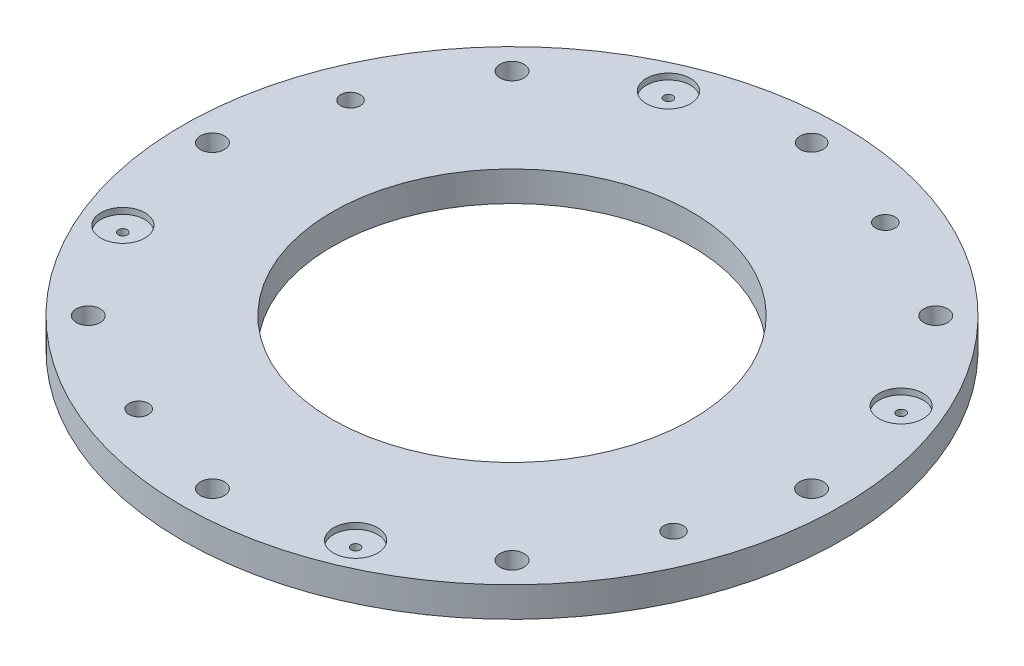
ISO-10303-21;
HEADER;
FILE_DESCRIPTION(('STEP AP214'),'2;1');
FILE_NAME('part.step','',(''),(''),'','','');
FILE_SCHEMA(('AUTOMOTIVE_DESIGN { 1 0 10303 214 1 1 1 1 }'));
ENDSEC;
DATA;
#1=APPLICATION_CONTEXT('core data for automotive mechanical design processes');
#2=APPLICATION_PROTOCOL_DEFINITION('international standard','automotive_design',2000,#1);
#3=PRODUCT_CONTEXT('',#1,'mechanical');
#4=PRODUCT('Part','Part','',(#3));
#5=PRODUCT_RELATED_PRODUCT_CATEGORY('part','',(#4));
#6=PRODUCT_DEFINITION_FORMATION('','',#4);
#7=PRODUCT_DEFINITION_CONTEXT('part definition',#1,'design');
#8=PRODUCT_DEFINITION('design','',#6,#7);
#9=PRODUCT_DEFINITION_SHAPE('','',#8);
#10=(LENGTH_UNIT() NAMED_UNIT(*) SI_UNIT(.MILLI.,.METRE.));
#11=(NAMED_UNIT(*) PLANE_ANGLE_UNIT() SI_UNIT($,.RADIAN.));
#12=(NAMED_UNIT(*) SI_UNIT($,.STERADIAN.) SOLID_ANGLE_UNIT());
#13=UNCERTAINTY_MEASURE_WITH_UNIT(LENGTH_MEASURE(1.E-05),#10,'distance_accuracy_value','');
#14=(GEOMETRIC_REPRESENTATION_CONTEXT(3) GLOBAL_UNCERTAINTY_ASSIGNED_CONTEXT((#13)) GLOBAL_UNIT_ASSIGNED_CONTEXT((#10,
#11,#12)) REPRESENTATION_CONTEXT('',''));
#15=CARTESIAN_POINT('',(0.,0.,0.));
#16=DIRECTION('',(0.,0.,1.));
#17=DIRECTION('',(1.,0.,0.));
#18=AXIS2_PLACEMENT_3D('',#15,#16,#17);
#19=CARTESIAN_POINT('',(0.,10.,0.));
#20=DIRECTION('',(0.,-1.,0.));
#21=DIRECTION('',(0.,0.,-1.));
#22=AXIS2_PLACEMENT_3D('',#19,#20,#21);
#23=CYLINDRICAL_SURFACE('',#22,110.);
#24=CARTESIAN_POINT('',(0.,10.,0.));
#25=DIRECTION('',(0.,1.,0.));
#26=DIRECTION('',(0.,0.,1.));
#27=AXIS2_PLACEMENT_3D('',#24,#25,#26);
#28=CIRCLE('',#27,110.);
#29=CARTESIAN_POINT('',(0.,10.,110.));
#30=VERTEX_POINT('',#29);
#31=EDGE_CURVE('E10',#30,#30,#28,.T.);
#32=ORIENTED_EDGE('',*,*,#31,.F.);
#33=EDGE_LOOP('',(#32));
#34=FACE_BOUND('',#33,.T.);
#35=CARTESIAN_POINT('',(0.,0.,0.));
#36=DIRECTION('',(0.,1.,0.));
#37=DIRECTION('',(0.,0.,1.));
#38=AXIS2_PLACEMENT_3D('',#35,#36,#37);
#39=CIRCLE('',#38,110.);
#40=CARTESIAN_POINT('',(0.,0.,110.));
#41=VERTEX_POINT('',#40);
#42=EDGE_CURVE('E42',#41,#41,#39,.T.);
#43=ORIENTED_EDGE('',*,*,#42,.T.);
#44=EDGE_LOOP('',(#43));
#45=FACE_BOUND('',#44,.T.);
#46=ADVANCED_FACE('F35',(#34,#45),#23,.T.);
#47=CARTESIAN_POINT('',(0.,10.,0.));
#48=DIRECTION('',(0.,1.,0.));
#49=DIRECTION('',(0.,0.,1.));
#50=AXIS2_PLACEMENT_3D('',#47,#48,#49);
#51=PLANE('',#50);
#52=CARTESIAN_POINT('',(91.046524442377,10.,-38.842229875376));
#53=DIRECTION('',(0.,1.,0.));
#54=DIRECTION('',(0.,0.,1.));
#55=AXIS2_PLACEMENT_3D('',#52,#53,#54);
#56=CIRCLE('',#55,7.35000000000001);
#57=CARTESIAN_POINT('',(91.046524442377,10.,-31.492229875376));
#58=VERTEX_POINT('',#57);
#59=EDGE_CURVE('E347',#58,#58,#56,.T.);
#60=ORIENTED_EDGE('',*,*,#59,.F.);
#61=EDGE_LOOP('',(#60));
#62=FACE_BOUND('',#61,.T.);
#63=CARTESIAN_POINT('',(38.842229875376,10.,91.046524442377));
#64=DIRECTION('',(0.,1.,0.));
#65=DIRECTION('',(0.,0.,1.));
#66=AXIS2_PLACEMENT_3D('',#63,#64,#65);
#67=CIRCLE('',#66,7.35000000000002);
#68=CARTESIAN_POINT('',(38.842229875376,10.,98.3965244423771));
#69=VERTEX_POINT('',#68);
#70=EDGE_CURVE('E350',#69,#69,#67,.T.);
#71=ORIENTED_EDGE('',*,*,#70,.F.);
#72=EDGE_LOOP('',(#71));
#73=FACE_BOUND('',#72,.T.);
#74=CARTESIAN_POINT('',(-91.046524442377,10.,38.842229875376));
#75=DIRECTION('',(0.,1.,0.));
#76=DIRECTION('',(0.,0.,1.));
#77=AXIS2_PLACEMENT_3D('',#74,#75,#76);
#78=CIRCLE('',#77,7.35000000000001);
#79=CARTESIAN_POINT('',(-91.046524442377,10.,46.192229875376));
#80=VERTEX_POINT('',#79);
#81=EDGE_CURVE('E356',#80,#80,#78,.T.);
#82=ORIENTED_EDGE('',*,*,#81,.F.);
#83=EDGE_LOOP('',(#82));
#84=FACE_BOUND('',#83,.T.);
#85=CARTESIAN_POINT('',(-38.842229875376,10.,-91.046524442377));
#86=DIRECTION('',(0.,1.,0.));
#87=DIRECTION('',(0.,0.,1.));
#88=AXIS2_PLACEMENT_3D('',#85,#86,#87);
#89=CIRCLE('',#88,7.34999999999999);
#90=CARTESIAN_POINT('',(-38.842229875376,10.,-83.696524442377));
#91=VERTEX_POINT('',#90);
#92=EDGE_CURVE('E68',#91,#91,#89,.T.);
#93=ORIENTED_EDGE('',*,*,#92,.F.);
#94=EDGE_LOOP('',(#93));
#95=FACE_BOUND('',#94,.T.);
#96=CARTESIAN_POINT('',(89.2547357831486,10.,35.3495705812719));
#97=DIRECTION('',(0.,1.,0.));
#98=DIRECTION('',(0.,0.,1.));
#99=AXIS2_PLACEMENT_3D('',#96,#97,#98);
#100=CIRCLE('',#99,3.25000000000002);
#101=CARTESIAN_POINT('',(89.2547357831486,10.,38.5995705812719));
#102=VERTEX_POINT('',#101);
#103=EDGE_CURVE('E81',#102,#102,#100,.T.);
#104=ORIENTED_EDGE('',*,*,#103,.F.);
#105=EDGE_LOOP('',(#104));
#106=FACE_BOUND('',#105,.T.);
#107=CARTESIAN_POINT('',(-35.3495705812719,10.,89.2547357831486));
#108=DIRECTION('',(0.,1.,0.));
#109=DIRECTION('',(0.,0.,1.));
#110=AXIS2_PLACEMENT_3D('',#107,#108,#109);
#111=CIRCLE('',#110,3.25000000000001);
#112=CARTESIAN_POINT('',(-35.3495705812719,10.,92.5047357831486));
#113=VERTEX_POINT('',#112);
#114=EDGE_CURVE('E84',#113,#113,#111,.T.);
#115=ORIENTED_EDGE('',*,*,#114,.F.);
#116=EDGE_LOOP('',(#115));
#117=FACE_BOUND('',#116,.T.);
#118=CARTESIAN_POINT('',(-89.2547357831486,10.,-35.3495705812719));
#119=DIRECTION('',(0.,1.,0.));
#120=DIRECTION('',(0.,0.,1.));
#121=AXIS2_PLACEMENT_3D('',#118,#119,#120);
#122=CIRCLE('',#121,3.25000000000002);
#123=CARTESIAN_POINT('',(-89.2547357831486,10.,-32.0995705812719));
#124=VERTEX_POINT('',#123);
#125=EDGE_CURVE('E90',#124,#124,#122,.T.);
#126=ORIENTED_EDGE('',*,*,#125,.F.);
#127=EDGE_LOOP('',(#126));
#128=FACE_BOUND('',#127,.T.);
#129=CARTESIAN_POINT('',(35.3495705812719,10.,-89.2547357831486));
#130=DIRECTION('',(0.,1.,0.));
#131=DIRECTION('',(0.,0.,1.));
#132=AXIS2_PLACEMENT_3D('',#129,#130,#131);
#133=CIRCLE('',#132,3.25000000000004);
#134=CARTESIAN_POINT('',(35.3495705812719,10.,-86.0047357831486));
#135=VERTEX_POINT('',#134);
#136=EDGE_CURVE('E96',#135,#135,#133,.T.);
#137=ORIENTED_EDGE('',*,*,#136,.F.);
#138=EDGE_LOOP('',(#137));
#139=FACE_BOUND('',#138,.T.);
#140=CARTESIAN_POINT('',(0.,10.,0.));
#141=DIRECTION('',(0.,1.,0.));
#142=DIRECTION('',(0.,0.,1.));
#143=AXIS2_PLACEMENT_3D('',#140,#141,#142);
#144=CIRCLE('',#143,60.);
#145=CARTESIAN_POINT('',(0.,10.,60.));
#146=VERTEX_POINT('',#145);
#147=EDGE_CURVE('E80',#146,#146,#144,.T.);
#148=ORIENTED_EDGE('',*,*,#147,.F.);
#149=EDGE_LOOP('',(#148));
#150=FACE_BOUND('',#149,.T.);
#151=CARTESIAN_POINT('',(-100.,10.,0.));
#152=DIRECTION('',(0.,1.,0.));
#153=DIRECTION('',(0.,0.,1.));
#154=AXIS2_PLACEMENT_3D('',#151,#152,#153);
#155=CIRCLE('',#154,4.00000000000001);
#156=CARTESIAN_POINT('',(-100.,10.,4.00000000000001));
#157=VERTEX_POINT('',#156);
#158=EDGE_CURVE('E111',#157,#157,#155,.T.);
#159=ORIENTED_EDGE('',*,*,#158,.F.);
#160=EDGE_LOOP('',(#159));
#161=FACE_BOUND('',#160,.T.);
#162=CARTESIAN_POINT('',(100.,10.,0.));
#163=DIRECTION('',(0.,1.,0.));
#164=DIRECTION('',(0.,0.,1.));
#165=AXIS2_PLACEMENT_3D('',#162,#163,#164);
#166=CIRCLE('',#165,4.00000000000001);
#167=CARTESIAN_POINT('',(100.,10.,4.00000000000001));
#168=VERTEX_POINT('',#167);
#169=EDGE_CURVE('E128',#168,#168,#166,.T.);
#170=ORIENTED_EDGE('',*,*,#169,.F.);
#171=EDGE_LOOP('',(#170));
#172=FACE_BOUND('',#171,.T.);
#173=CARTESIAN_POINT('',(70.7106781186548,10.,-70.7106781186548));
#174=DIRECTION('',(0.,1.,0.));
#175=DIRECTION('',(0.,0.,1.));
#176=AXIS2_PLACEMENT_3D('',#173,#174,#175);
#177=CIRCLE('',#176,4.00000000000002);
#178=CARTESIAN_POINT('',(70.7106781186548,10.,-66.7106781186548));
#179=VERTEX_POINT('',#178);
#180=EDGE_CURVE('E122',#179,#179,#177,.T.);
#181=ORIENTED_EDGE('',*,*,#180,.F.);
#182=EDGE_LOOP('',(#181));
#183=FACE_BOUND('',#182,.T.);
#184=CARTESIAN_POINT('',(0.,10.,-100.));
#185=DIRECTION('',(0.,1.,0.));
#186=DIRECTION('',(0.,0.,1.));
#187=AXIS2_PLACEMENT_3D('',#184,#185,#186);
#188=CIRCLE('',#187,3.86210274699493);
#189=CARTESIAN_POINT('',(0.,10.,-96.1378972530051));
#190=VERTEX_POINT('',#189);
#191=EDGE_CURVE('E115',#190,#190,#188,.T.);
#192=ORIENTED_EDGE('',*,*,#191,.F.);
#193=EDGE_LOOP('',(#192));
#194=FACE_BOUND('',#193,.T.);
#195=CARTESIAN_POINT('',(-70.7106781186548,10.,70.7106781186548));
#196=DIRECTION('',(0.,1.,0.));
#197=DIRECTION('',(0.,0.,1.));
#198=AXIS2_PLACEMENT_3D('',#195,#196,#197);
#199=CIRCLE('',#198,4.00000000000001);
#200=CARTESIAN_POINT('',(-70.7106781186548,10.,74.7106781186548));
#201=VERTEX_POINT('',#200);
#202=EDGE_CURVE('E114',#201,#201,#199,.T.);
#203=ORIENTED_EDGE('',*,*,#202,.F.);
#204=EDGE_LOOP('',(#203));
#205=FACE_BOUND('',#204,.T.);
#206=CARTESIAN_POINT('',(0.,10.,100.));
#207=DIRECTION('',(0.,1.,0.));
#208=DIRECTION('',(0.,0.,1.));
#209=AXIS2_PLACEMENT_3D('',#206,#207,#208);
#210=CIRCLE('',#209,4.);
#211=CARTESIAN_POINT('',(0.,10.,104.));
#212=VERTEX_POINT('',#211);
#213=EDGE_CURVE('E148',#212,#212,#210,.T.);
#214=ORIENTED_EDGE('',*,*,#213,.F.);
#215=EDGE_LOOP('',(#214));
#216=FACE_BOUND('',#215,.T.);
#217=CARTESIAN_POINT('',(70.7106781186548,10.,70.7106781186548));
#218=DIRECTION('',(0.,1.,0.));
#219=DIRECTION('',(0.,0.,1.));
#220=AXIS2_PLACEMENT_3D('',#217,#218,#219);
#221=CIRCLE('',#220,3.99999999999999);
#222=CARTESIAN_POINT('',(70.7106781186548,10.,74.7106781186547));
#223=VERTEX_POINT('',#222);
#224=EDGE_CURVE('E133',#223,#223,#221,.T.);
#225=ORIENTED_EDGE('',*,*,#224,.F.);
#226=EDGE_LOOP('',(#225));
#227=FACE_BOUND('',#226,.T.);
#228=CARTESIAN_POINT('',(-70.7106781186548,10.,-70.7106781186548));
#229=DIRECTION('',(0.,1.,0.));
#230=DIRECTION('',(0.,0.,1.));
#231=AXIS2_PLACEMENT_3D('',#228,#229,#230);
#232=CIRCLE('',#231,4.00000000000001);
#233=CARTESIAN_POINT('',(-70.7106781186548,10.,-66.7106781186548));
#234=VERTEX_POINT('',#233);
#235=EDGE_CURVE('E139',#234,#234,#232,.T.);
#236=ORIENTED_EDGE('',*,*,#235,.F.);
#237=EDGE_LOOP('',(#236));
#238=FACE_BOUND('',#237,.T.);
#239=ORIENTED_EDGE('',*,*,#31,.T.);
#240=EDGE_LOOP('',(#239));
#241=FACE_BOUND('',#240,.T.);
#242=ADVANCED_FACE('F175',(#62,#73,#84,#95,#106,#117,#128,#139,#150,#161,#172,#183,#194,#205,
#216,#227,#238,#241),#51,.T.);
#243=CARTESIAN_POINT('',(0.,0.,0.));
#244=DIRECTION('',(0.,1.,0.));
#245=DIRECTION('',(0.,0.,1.));
#246=AXIS2_PLACEMENT_3D('',#243,#244,#245);
#247=PLANE('',#246);
#248=CARTESIAN_POINT('',(-38.842229875376,0.,-91.046524442377));
#249=DIRECTION('',(0.,1.,0.));
#250=DIRECTION('',(0.,0.,1.));
#251=AXIS2_PLACEMENT_3D('',#248,#249,#250);
#252=CIRCLE('',#251,1.5);
#253=CARTESIAN_POINT('',(-38.842229875376,0.,-89.546524442377));
#254=VERTEX_POINT('',#253);
#255=EDGE_CURVE('E57',#254,#254,#252,.T.);
#256=ORIENTED_EDGE('',*,*,#255,.T.);
#257=EDGE_LOOP('',(#256));
#258=FACE_BOUND('',#257,.T.);
#259=CARTESIAN_POINT('',(91.046524442377,0.,-38.842229875376));
#260=DIRECTION('',(0.,1.,0.));
#261=DIRECTION('',(0.,0.,1.));
#262=AXIS2_PLACEMENT_3D('',#259,#260,#261);
#263=CIRCLE('',#262,1.5);
#264=CARTESIAN_POINT('',(91.046524442377,0.,-37.342229875376));
#265=VERTEX_POINT('',#264);
#266=EDGE_CURVE('E197',#265,#265,#263,.T.);
#267=ORIENTED_EDGE('',*,*,#266,.T.);
#268=EDGE_LOOP('',(#267));
#269=FACE_BOUND('',#268,.T.);
#270=CARTESIAN_POINT('',(38.842229875376,0.,91.046524442377));
#271=DIRECTION('',(0.,1.,0.));
#272=DIRECTION('',(0.,0.,1.));
#273=AXIS2_PLACEMENT_3D('',#270,#271,#272);
#274=CIRCLE('',#273,1.5);
#275=CARTESIAN_POINT('',(38.842229875376,0.,92.546524442377));
#276=VERTEX_POINT('',#275);
#277=EDGE_CURVE('E201',#276,#276,#274,.T.);
#278=ORIENTED_EDGE('',*,*,#277,.T.);
#279=EDGE_LOOP('',(#278));
#280=FACE_BOUND('',#279,.T.);
#281=CARTESIAN_POINT('',(-91.046524442377,0.,38.842229875376));
#282=DIRECTION('',(0.,1.,0.));
#283=DIRECTION('',(0.,0.,1.));
#284=AXIS2_PLACEMENT_3D('',#281,#282,#283);
#285=CIRCLE('',#284,1.5);
#286=CARTESIAN_POINT('',(-91.046524442377,0.,40.342229875376));
#287=VERTEX_POINT('',#286);
#288=EDGE_CURVE('E205',#287,#287,#285,.T.);
#289=ORIENTED_EDGE('',*,*,#288,.T.);
#290=EDGE_LOOP('',(#289));
#291=FACE_BOUND('',#290,.T.);
#292=CARTESIAN_POINT('',(89.2547357831486,0.,35.3495705812719));
#293=DIRECTION('',(0.,1.,0.));
#294=DIRECTION('',(0.,0.,1.));
#295=AXIS2_PLACEMENT_3D('',#292,#293,#294);
#296=CIRCLE('',#295,3.25000000000002);
#297=CARTESIAN_POINT('',(89.2547357831486,0.,38.5995705812719));
#298=VERTEX_POINT('',#297);
#299=EDGE_CURVE('E77',#298,#298,#296,.T.);
#300=ORIENTED_EDGE('',*,*,#299,.T.);
#301=EDGE_LOOP('',(#300));
#302=FACE_BOUND('',#301,.T.);
#303=CARTESIAN_POINT('',(-35.3495705812719,0.,89.2547357831486));
#304=DIRECTION('',(0.,1.,0.));
#305=DIRECTION('',(0.,0.,1.));
#306=AXIS2_PLACEMENT_3D('',#303,#304,#305);
#307=CIRCLE('',#306,3.25000000000001);
#308=CARTESIAN_POINT('',(-35.3495705812719,0.,92.5047357831486));
#309=VERTEX_POINT('',#308);
#310=EDGE_CURVE('E87',#309,#309,#307,.T.);
#311=ORIENTED_EDGE('',*,*,#310,.T.);
#312=EDGE_LOOP('',(#311));
#313=FACE_BOUND('',#312,.T.);
#314=CARTESIAN_POINT('',(-89.2547357831486,0.,-35.3495705812719));
#315=DIRECTION('',(0.,1.,0.));
#316=DIRECTION('',(0.,0.,1.));
#317=AXIS2_PLACEMENT_3D('',#314,#315,#316);
#318=CIRCLE('',#317,3.25000000000002);
#319=CARTESIAN_POINT('',(-89.2547357831486,0.,-32.0995705812719));
#320=VERTEX_POINT('',#319);
#321=EDGE_CURVE('E93',#320,#320,#318,.T.);
#322=ORIENTED_EDGE('',*,*,#321,.T.);
#323=EDGE_LOOP('',(#322));
#324=FACE_BOUND('',#323,.T.);
#325=CARTESIAN_POINT('',(35.3495705812719,0.,-89.2547357831486));
#326=DIRECTION('',(0.,1.,0.));
#327=DIRECTION('',(0.,0.,1.));
#328=AXIS2_PLACEMENT_3D('',#325,#326,#327);
#329=CIRCLE('',#328,3.25000000000004);
#330=CARTESIAN_POINT('',(35.3495705812719,0.,-86.0047357831486));
#331=VERTEX_POINT('',#330);
#332=EDGE_CURVE('E99',#331,#331,#329,.T.);
#333=ORIENTED_EDGE('',*,*,#332,.T.);
#334=EDGE_LOOP('',(#333));
#335=FACE_BOUND('',#334,.T.);
#336=CARTESIAN_POINT('',(0.,0.,0.));
#337=DIRECTION('',(0.,1.,0.));
#338=DIRECTION('',(0.,0.,1.));
#339=AXIS2_PLACEMENT_3D('',#336,#337,#338);
#340=CIRCLE('',#339,60.);
#341=CARTESIAN_POINT('',(0.,0.,60.));
#342=VERTEX_POINT('',#341);
#343=EDGE_CURVE('E103',#342,#342,#340,.T.);
#344=ORIENTED_EDGE('',*,*,#343,.T.);
#345=EDGE_LOOP('',(#344));
#346=FACE_BOUND('',#345,.T.);
#347=CARTESIAN_POINT('',(-100.,0.,0.));
#348=DIRECTION('',(0.,1.,0.));
#349=DIRECTION('',(0.,0.,1.));
#350=AXIS2_PLACEMENT_3D('',#347,#348,#349);
#351=CIRCLE('',#350,4.00000000000001);
#352=CARTESIAN_POINT('',(-100.,0.,4.00000000000001));
#353=VERTEX_POINT('',#352);
#354=EDGE_CURVE('E47',#353,#353,#351,.T.);
#355=ORIENTED_EDGE('',*,*,#354,.T.);
#356=EDGE_LOOP('',(#355));
#357=FACE_BOUND('',#356,.T.);
#358=CARTESIAN_POINT('',(100.,0.,0.));
#359=DIRECTION('',(0.,1.,0.));
#360=DIRECTION('',(0.,0.,1.));
#361=AXIS2_PLACEMENT_3D('',#358,#359,#360);
#362=CIRCLE('',#361,4.00000000000001);
#363=CARTESIAN_POINT('',(100.,0.,4.00000000000001));
#364=VERTEX_POINT('',#363);
#365=EDGE_CURVE('E106',#364,#364,#362,.T.);
#366=ORIENTED_EDGE('',*,*,#365,.T.);
#367=EDGE_LOOP('',(#366));
#368=FACE_BOUND('',#367,.T.);
#369=CARTESIAN_POINT('',(70.7106781186548,0.,-70.7106781186548));
#370=DIRECTION('',(0.,1.,0.));
#371=DIRECTION('',(0.,0.,1.));
#372=AXIS2_PLACEMENT_3D('',#369,#370,#371);
#373=CIRCLE('',#372,4.00000000000002);
#374=CARTESIAN_POINT('',(70.7106781186548,0.,-66.7106781186548));
#375=VERTEX_POINT('',#374);
#376=EDGE_CURVE('E125',#375,#375,#373,.T.);
#377=ORIENTED_EDGE('',*,*,#376,.T.);
#378=EDGE_LOOP('',(#377));
#379=FACE_BOUND('',#378,.T.);
#380=CARTESIAN_POINT('',(0.,0.,-100.));
#381=DIRECTION('',(0.,1.,0.));
#382=DIRECTION('',(0.,0.,1.));
#383=AXIS2_PLACEMENT_3D('',#380,#381,#382);
#384=CIRCLE('',#383,3.86210274699493);
#385=CARTESIAN_POINT('',(0.,0.,-96.1378972530051));
#386=VERTEX_POINT('',#385);
#387=EDGE_CURVE('E119',#386,#386,#384,.T.);
#388=ORIENTED_EDGE('',*,*,#387,.T.);
#389=EDGE_LOOP('',(#388));
#390=FACE_BOUND('',#389,.T.);
#391=CARTESIAN_POINT('',(-70.7106781186548,0.,70.7106781186548));
#392=DIRECTION('',(0.,1.,0.));
#393=DIRECTION('',(0.,0.,1.));
#394=AXIS2_PLACEMENT_3D('',#391,#392,#393);
#395=CIRCLE('',#394,4.00000000000001);
#396=CARTESIAN_POINT('',(-70.7106781186548,0.,74.7106781186548));
#397=VERTEX_POINT('',#396);
#398=EDGE_CURVE('E146',#397,#397,#395,.T.);
#399=ORIENTED_EDGE('',*,*,#398,.T.);
#400=EDGE_LOOP('',(#399));
#401=FACE_BOUND('',#400,.T.);
#402=CARTESIAN_POINT('',(0.,0.,100.));
#403=DIRECTION('',(0.,1.,0.));
#404=DIRECTION('',(0.,0.,1.));
#405=AXIS2_PLACEMENT_3D('',#402,#403,#404);
#406=CIRCLE('',#405,4.);
#407=CARTESIAN_POINT('',(0.,0.,104.));
#408=VERTEX_POINT('',#407);
#409=EDGE_CURVE('E50',#408,#408,#406,.T.);
#410=ORIENTED_EDGE('',*,*,#409,.T.);
#411=EDGE_LOOP('',(#410));
#412=FACE_BOUND('',#411,.T.);
#413=CARTESIAN_POINT('',(70.7106781186548,0.,70.7106781186548));
#414=DIRECTION('',(0.,1.,0.));
#415=DIRECTION('',(0.,0.,1.));
#416=AXIS2_PLACEMENT_3D('',#413,#414,#415);
#417=CIRCLE('',#416,3.99999999999999);
#418=CARTESIAN_POINT('',(70.7106781186548,0.,74.7106781186547));
#419=VERTEX_POINT('',#418);
#420=EDGE_CURVE('E136',#419,#419,#417,.T.);
#421=ORIENTED_EDGE('',*,*,#420,.T.);
#422=EDGE_LOOP('',(#421));
#423=FACE_BOUND('',#422,.T.);
#424=CARTESIAN_POINT('',(-70.7106781186548,0.,-70.7106781186548));
#425=DIRECTION('',(0.,1.,0.));
#426=DIRECTION('',(0.,0.,1.));
#427=AXIS2_PLACEMENT_3D('',#424,#425,#426);
#428=CIRCLE('',#427,4.00000000000001);
#429=CARTESIAN_POINT('',(-70.7106781186548,0.,-66.7106781186548));
#430=VERTEX_POINT('',#429);
#431=EDGE_CURVE('E118',#430,#430,#428,.T.);
#432=ORIENTED_EDGE('',*,*,#431,.T.);
#433=EDGE_LOOP('',(#432));
#434=FACE_BOUND('',#433,.T.);
#435=ORIENTED_EDGE('',*,*,#42,.F.);
#436=EDGE_LOOP('',(#435));
#437=FACE_BOUND('',#436,.T.);
#438=ADVANCED_FACE('F155',(#258,#269,#280,#291,#302,#313,#324,#335,#346,#357,#368,#379,#390,
#401,#412,#423,#434,#437),#247,.F.);
#439=CARTESIAN_POINT('',(-70.7106781186548,0.,-70.7106781186548));
#440=DIRECTION('',(0.,1.,0.));
#441=DIRECTION('',(0.,0.,1.));
#442=AXIS2_PLACEMENT_3D('',#439,#440,#441);
#443=CYLINDRICAL_SURFACE('',#442,4.00000000000001);
#444=ORIENTED_EDGE('',*,*,#431,.F.);
#445=EDGE_LOOP('',(#444));
#446=FACE_BOUND('',#445,.T.);
#447=ORIENTED_EDGE('',*,*,#235,.T.);
#448=EDGE_LOOP('',(#447));
#449=FACE_BOUND('',#448,.T.);
#450=ADVANCED_FACE('F170',(#446,#449),#443,.F.);
#451=CARTESIAN_POINT('',(70.7106781186548,0.,70.7106781186548));
#452=DIRECTION('',(0.,1.,0.));
#453=DIRECTION('',(0.,0.,1.));
#454=AXIS2_PLACEMENT_3D('',#451,#452,#453);
#455=CYLINDRICAL_SURFACE('',#454,3.99999999999999);
#456=ORIENTED_EDGE('',*,*,#420,.F.);
#457=EDGE_LOOP('',(#456));
#458=FACE_BOUND('',#457,.T.);
#459=ORIENTED_EDGE('',*,*,#224,.T.);
#460=EDGE_LOOP('',(#459));
#461=FACE_BOUND('',#460,.T.);
#462=ADVANCED_FACE('F161',(#458,#461),#455,.F.);
#463=CARTESIAN_POINT('',(0.,0.,100.));
#464=DIRECTION('',(0.,1.,0.));
#465=DIRECTION('',(0.,0.,1.));
#466=AXIS2_PLACEMENT_3D('',#463,#464,#465);
#467=CYLINDRICAL_SURFACE('',#466,4.);
#468=ORIENTED_EDGE('',*,*,#409,.F.);
#469=EDGE_LOOP('',(#468));
#470=FACE_BOUND('',#469,.T.);
#471=ORIENTED_EDGE('',*,*,#213,.T.);
#472=EDGE_LOOP('',(#471));
#473=FACE_BOUND('',#472,.T.);
#474=ADVANCED_FACE('F158',(#470,#473),#467,.F.);
#475=CARTESIAN_POINT('',(-70.7106781186548,0.,70.7106781186548));
#476=DIRECTION('',(0.,1.,0.));
#477=DIRECTION('',(0.,0.,1.));
#478=AXIS2_PLACEMENT_3D('',#475,#476,#477);
#479=CYLINDRICAL_SURFACE('',#478,4.00000000000001);
#480=ORIENTED_EDGE('',*,*,#398,.F.);
#481=EDGE_LOOP('',(#480));
#482=FACE_BOUND('',#481,.T.);
#483=ORIENTED_EDGE('',*,*,#202,.T.);
#484=EDGE_LOOP('',(#483));
#485=FACE_BOUND('',#484,.T.);
#486=ADVANCED_FACE('F160',(#482,#485),#479,.F.);
#487=CARTESIAN_POINT('',(0.,0.,-100.));
#488=DIRECTION('',(0.,1.,0.));
#489=DIRECTION('',(0.,0.,1.));
#490=AXIS2_PLACEMENT_3D('',#487,#488,#489);
#491=CYLINDRICAL_SURFACE('',#490,3.86210274699493);
#492=ORIENTED_EDGE('',*,*,#387,.F.);
#493=EDGE_LOOP('',(#492));
#494=FACE_BOUND('',#493,.T.);
#495=ORIENTED_EDGE('',*,*,#191,.T.);
#496=EDGE_LOOP('',(#495));
#497=FACE_BOUND('',#496,.T.);
#498=ADVANCED_FACE('F167',(#494,#497),#491,.F.);
#499=CARTESIAN_POINT('',(70.7106781186548,0.,-70.7106781186548));
#500=DIRECTION('',(0.,1.,0.));
#501=DIRECTION('',(0.,0.,1.));
#502=AXIS2_PLACEMENT_3D('',#499,#500,#501);
#503=CYLINDRICAL_SURFACE('',#502,4.00000000000002);
#504=ORIENTED_EDGE('',*,*,#376,.F.);
#505=EDGE_LOOP('',(#504));
#506=FACE_BOUND('',#505,.T.);
#507=ORIENTED_EDGE('',*,*,#180,.T.);
#508=EDGE_LOOP('',(#507));
#509=FACE_BOUND('',#508,.T.);
#510=ADVANCED_FACE('F238',(#506,#509),#503,.F.);
#511=CARTESIAN_POINT('',(100.,0.,0.));
#512=DIRECTION('',(0.,1.,0.));
#513=DIRECTION('',(0.,0.,1.));
#514=AXIS2_PLACEMENT_3D('',#511,#512,#513);
#515=CYLINDRICAL_SURFACE('',#514,4.00000000000001);
#516=ORIENTED_EDGE('',*,*,#365,.F.);
#517=EDGE_LOOP('',(#516));
#518=FACE_BOUND('',#517,.T.);
#519=ORIENTED_EDGE('',*,*,#169,.T.);
#520=EDGE_LOOP('',(#519));
#521=FACE_BOUND('',#520,.T.);
#522=ADVANCED_FACE('F245',(#518,#521),#515,.F.);
#523=CARTESIAN_POINT('',(-100.,0.,0.));
#524=DIRECTION('',(0.,1.,0.));
#525=DIRECTION('',(0.,0.,1.));
#526=AXIS2_PLACEMENT_3D('',#523,#524,#525);
#527=CYLINDRICAL_SURFACE('',#526,4.00000000000001);
#528=ORIENTED_EDGE('',*,*,#354,.F.);
#529=EDGE_LOOP('',(#528));
#530=FACE_BOUND('',#529,.T.);
#531=ORIENTED_EDGE('',*,*,#158,.T.);
#532=EDGE_LOOP('',(#531));
#533=FACE_BOUND('',#532,.T.);
#534=ADVANCED_FACE('F249',(#530,#533),#527,.F.);
#535=CARTESIAN_POINT('',(0.,0.,0.));
#536=DIRECTION('',(0.,1.,0.));
#537=DIRECTION('',(0.,0.,1.));
#538=AXIS2_PLACEMENT_3D('',#535,#536,#537);
#539=CYLINDRICAL_SURFACE('',#538,60.);
#540=ORIENTED_EDGE('',*,*,#343,.F.);
#541=EDGE_LOOP('',(#540));
#542=FACE_BOUND('',#541,.T.);
#543=ORIENTED_EDGE('',*,*,#147,.T.);
#544=EDGE_LOOP('',(#543));
#545=FACE_BOUND('',#544,.T.);
#546=ADVANCED_FACE('F257',(#542,#545),#539,.F.);
#547=CARTESIAN_POINT('',(35.3495705812719,0.,-89.2547357831486));
#548=DIRECTION('',(0.,1.,0.));
#549=DIRECTION('',(0.,0.,1.));
#550=AXIS2_PLACEMENT_3D('',#547,#548,#549);
#551=CYLINDRICAL_SURFACE('',#550,3.25000000000004);
#552=ORIENTED_EDGE('',*,*,#332,.F.);
#553=EDGE_LOOP('',(#552));
#554=FACE_BOUND('',#553,.T.);
#555=ORIENTED_EDGE('',*,*,#136,.T.);
#556=EDGE_LOOP('',(#555));
#557=FACE_BOUND('',#556,.T.);
#558=ADVANCED_FACE('F268',(#554,#557),#551,.F.);
#559=CARTESIAN_POINT('',(-89.2547357831486,0.,-35.3495705812719));
#560=DIRECTION('',(0.,1.,0.));
#561=DIRECTION('',(0.,0.,1.));
#562=AXIS2_PLACEMENT_3D('',#559,#560,#561);
#563=CYLINDRICAL_SURFACE('',#562,3.25000000000002);
#564=ORIENTED_EDGE('',*,*,#321,.F.);
#565=EDGE_LOOP('',(#564));
#566=FACE_BOUND('',#565,.T.);
#567=ORIENTED_EDGE('',*,*,#125,.T.);
#568=EDGE_LOOP('',(#567));
#569=FACE_BOUND('',#568,.T.);
#570=ADVANCED_FACE('F276',(#566,#569),#563,.F.);
#571=CARTESIAN_POINT('',(-35.3495705812719,0.,89.2547357831486));
#572=DIRECTION('',(0.,1.,0.));
#573=DIRECTION('',(0.,0.,1.));
#574=AXIS2_PLACEMENT_3D('',#571,#572,#573);
#575=CYLINDRICAL_SURFACE('',#574,3.25000000000001);
#576=ORIENTED_EDGE('',*,*,#310,.F.);
#577=EDGE_LOOP('',(#576));
#578=FACE_BOUND('',#577,.T.);
#579=ORIENTED_EDGE('',*,*,#114,.T.);
#580=EDGE_LOOP('',(#579));
#581=FACE_BOUND('',#580,.T.);
#582=ADVANCED_FACE('F283',(#578,#581),#575,.F.);
#583=CARTESIAN_POINT('',(89.2547357831486,0.,35.3495705812719));
#584=DIRECTION('',(0.,1.,0.));
#585=DIRECTION('',(0.,0.,1.));
#586=AXIS2_PLACEMENT_3D('',#583,#584,#585);
#587=CYLINDRICAL_SURFACE('',#586,3.25000000000002);
#588=ORIENTED_EDGE('',*,*,#299,.F.);
#589=EDGE_LOOP('',(#588));
#590=FACE_BOUND('',#589,.T.);
#591=ORIENTED_EDGE('',*,*,#103,.T.);
#592=EDGE_LOOP('',(#591));
#593=FACE_BOUND('',#592,.T.);
#594=ADVANCED_FACE('F287',(#590,#593),#587,.F.);
#595=CARTESIAN_POINT('',(-38.842229875376,8.,-91.046524442377));
#596=DIRECTION('',(0.,1.,0.));
#597=DIRECTION('',(0.,0.,1.));
#598=AXIS2_PLACEMENT_3D('',#595,#596,#597);
#599=CYLINDRICAL_SURFACE('',#598,7.34999999999999);
#600=CARTESIAN_POINT('',(-38.842229875376,8.,-91.046524442377));
#601=DIRECTION('',(0.,1.,0.));
#602=DIRECTION('',(0.,0.,1.));
#603=AXIS2_PLACEMENT_3D('',#600,#601,#602);
#604=CIRCLE('',#603,7.34999999999999);
#605=CARTESIAN_POINT('',(-38.842229875376,8.,-83.696524442377));
#606=VERTEX_POINT('',#605);
#607=EDGE_CURVE('E64',#606,#606,#604,.T.);
#608=ORIENTED_EDGE('',*,*,#607,.F.);
#609=EDGE_LOOP('',(#608));
#610=FACE_BOUND('',#609,.T.);
#611=ORIENTED_EDGE('',*,*,#92,.T.);
#612=EDGE_LOOP('',(#611));
#613=FACE_BOUND('',#612,.T.);
#614=ADVANCED_FACE('F291',(#610,#613),#599,.F.);
#615=CARTESIAN_POINT('',(-38.842229875376,8.,-91.046524442377));
#616=DIRECTION('',(0.,1.,0.));
#617=DIRECTION('',(0.,0.,1.));
#618=AXIS2_PLACEMENT_3D('',#615,#616,#617);
#619=PLANE('',#618);
#620=CARTESIAN_POINT('',(-38.842229875376,8.,-91.046524442377));
#621=DIRECTION('',(0.,1.,0.));
#622=DIRECTION('',(0.,0.,1.));
#623=AXIS2_PLACEMENT_3D('',#620,#621,#622);
#624=CIRCLE('',#623,1.5);
#625=CARTESIAN_POINT('',(-38.842229875376,8.,-89.546524442377));
#626=VERTEX_POINT('',#625);
#627=EDGE_CURVE('E38',#626,#626,#624,.T.);
#628=ORIENTED_EDGE('',*,*,#627,.F.);
#629=EDGE_LOOP('',(#628));
#630=FACE_BOUND('',#629,.T.);
#631=ORIENTED_EDGE('',*,*,#607,.T.);
#632=EDGE_LOOP('',(#631));
#633=FACE_BOUND('',#632,.T.);
#634=ADVANCED_FACE('F293',(#630,#633),#619,.T.);
#635=CARTESIAN_POINT('',(-91.046524442377,8.,38.842229875376));
#636=DIRECTION('',(0.,1.,0.));
#637=DIRECTION('',(0.,0.,1.));
#638=AXIS2_PLACEMENT_3D('',#635,#636,#637);
#639=CYLINDRICAL_SURFACE('',#638,7.35000000000001);
#640=CARTESIAN_POINT('',(-91.046524442377,8.,38.842229875376));
#641=DIRECTION('',(0.,1.,0.));
#642=DIRECTION('',(0.,0.,1.));
#643=AXIS2_PLACEMENT_3D('',#640,#641,#642);
#644=CIRCLE('',#643,7.35000000000001);
#645=CARTESIAN_POINT('',(-91.046524442377,8.,46.192229875376));
#646=VERTEX_POINT('',#645);
#647=EDGE_CURVE('E73',#646,#646,#644,.T.);
#648=ORIENTED_EDGE('',*,*,#647,.F.);
#649=EDGE_LOOP('',(#648));
#650=FACE_BOUND('',#649,.T.);
#651=ORIENTED_EDGE('',*,*,#81,.T.);
#652=EDGE_LOOP('',(#651));
#653=FACE_BOUND('',#652,.T.);
#654=ADVANCED_FACE('F296',(#650,#653),#639,.F.);
#655=CARTESIAN_POINT('',(-91.046524442377,8.,38.842229875376));
#656=DIRECTION('',(0.,1.,0.));
#657=DIRECTION('',(0.,0.,1.));
#658=AXIS2_PLACEMENT_3D('',#655,#656,#657);
#659=PLANE('',#658);
#660=CARTESIAN_POINT('',(-91.046524442377,8.,38.842229875376));
#661=DIRECTION('',(0.,1.,0.));
#662=DIRECTION('',(0.,0.,1.));
#663=AXIS2_PLACEMENT_3D('',#660,#661,#662);
#664=CIRCLE('',#663,1.5);
#665=CARTESIAN_POINT('',(-91.046524442377,8.,40.342229875376));
#666=VERTEX_POINT('',#665);
#667=EDGE_CURVE('E59',#666,#666,#664,.T.);
#668=ORIENTED_EDGE('',*,*,#667,.F.);
#669=EDGE_LOOP('',(#668));
#670=FACE_BOUND('',#669,.T.);
#671=ORIENTED_EDGE('',*,*,#647,.T.);
#672=EDGE_LOOP('',(#671));
#673=FACE_BOUND('',#672,.T.);
#674=ADVANCED_FACE('F301',(#670,#673),#659,.T.);
#675=CARTESIAN_POINT('',(38.842229875376,8.,91.046524442377));
#676=DIRECTION('',(0.,1.,0.));
#677=DIRECTION('',(0.,0.,1.));
#678=AXIS2_PLACEMENT_3D('',#675,#676,#677);
#679=CYLINDRICAL_SURFACE('',#678,7.35000000000002);
#680=CARTESIAN_POINT('',(38.842229875376,8.,91.046524442377));
#681=DIRECTION('',(0.,1.,0.));
#682=DIRECTION('',(0.,0.,1.));
#683=AXIS2_PLACEMENT_3D('',#680,#681,#682);
#684=CIRCLE('',#683,7.35000000000002);
#685=CARTESIAN_POINT('',(38.842229875376,8.,98.3965244423771));
#686=VERTEX_POINT('',#685);
#687=EDGE_CURVE('E353',#686,#686,#684,.T.);
#688=ORIENTED_EDGE('',*,*,#687,.F.);
#689=EDGE_LOOP('',(#688));
#690=FACE_BOUND('',#689,.T.);
#691=ORIENTED_EDGE('',*,*,#70,.T.);
#692=EDGE_LOOP('',(#691));
#693=FACE_BOUND('',#692,.T.);
#694=ADVANCED_FACE('F304',(#690,#693),#679,.F.);
#695=CARTESIAN_POINT('',(38.842229875376,8.,91.046524442377));
#696=DIRECTION('',(0.,1.,0.));
#697=DIRECTION('',(0.,0.,1.));
#698=AXIS2_PLACEMENT_3D('',#695,#696,#697);
#699=PLANE('',#698);
#700=CARTESIAN_POINT('',(38.842229875376,8.,91.046524442377));
#701=DIRECTION('',(0.,1.,0.));
#702=DIRECTION('',(0.,0.,1.));
#703=AXIS2_PLACEMENT_3D('',#700,#701,#702);
#704=CIRCLE('',#703,1.5);
#705=CARTESIAN_POINT('',(38.842229875376,8.,92.546524442377));
#706=VERTEX_POINT('',#705);
#707=EDGE_CURVE('E56',#706,#706,#704,.T.);
#708=ORIENTED_EDGE('',*,*,#707,.F.);
#709=EDGE_LOOP('',(#708));
#710=FACE_BOUND('',#709,.T.);
#711=ORIENTED_EDGE('',*,*,#687,.T.);
#712=EDGE_LOOP('',(#711));
#713=FACE_BOUND('',#712,.T.);
#714=ADVANCED_FACE('F309',(#710,#713),#699,.T.);
#715=CARTESIAN_POINT('',(91.046524442377,8.,-38.842229875376));
#716=DIRECTION('',(0.,1.,0.));
#717=DIRECTION('',(0.,0.,1.));
#718=AXIS2_PLACEMENT_3D('',#715,#716,#717);
#719=CYLINDRICAL_SURFACE('',#718,7.35000000000001);
#720=CARTESIAN_POINT('',(91.046524442377,8.,-38.842229875376));
#721=DIRECTION('',(0.,1.,0.));
#722=DIRECTION('',(0.,0.,1.));
#723=AXIS2_PLACEMENT_3D('',#720,#721,#722);
#724=CIRCLE('',#723,7.35000000000001);
#725=CARTESIAN_POINT('',(91.046524442377,8.,-31.492229875376));
#726=VERTEX_POINT('',#725);
#727=EDGE_CURVE('E102',#726,#726,#724,.T.);
#728=ORIENTED_EDGE('',*,*,#727,.F.);
#729=EDGE_LOOP('',(#728));
#730=FACE_BOUND('',#729,.T.);
#731=ORIENTED_EDGE('',*,*,#59,.T.);
#732=EDGE_LOOP('',(#731));
#733=FACE_BOUND('',#732,.T.);
#734=ADVANCED_FACE('F312',(#730,#733),#719,.F.);
#735=CARTESIAN_POINT('',(91.046524442377,8.,-38.842229875376));
#736=DIRECTION('',(0.,1.,0.));
#737=DIRECTION('',(0.,0.,1.));
#738=AXIS2_PLACEMENT_3D('',#735,#736,#737);
#739=PLANE('',#738);
#740=CARTESIAN_POINT('',(91.046524442377,8.,-38.842229875376));
#741=DIRECTION('',(0.,1.,0.));
#742=DIRECTION('',(0.,0.,1.));
#743=AXIS2_PLACEMENT_3D('',#740,#741,#742);
#744=CIRCLE('',#743,1.5);
#745=CARTESIAN_POINT('',(91.046524442377,8.,-37.342229875376));
#746=VERTEX_POINT('',#745);
#747=EDGE_CURVE('E53',#746,#746,#744,.T.);
#748=ORIENTED_EDGE('',*,*,#747,.F.);
#749=EDGE_LOOP('',(#748));
#750=FACE_BOUND('',#749,.T.);
#751=ORIENTED_EDGE('',*,*,#727,.T.);
#752=EDGE_LOOP('',(#751));
#753=FACE_BOUND('',#752,.T.);
#754=ADVANCED_FACE('F319',(#750,#753),#739,.T.);
#755=CARTESIAN_POINT('',(91.046524442377,0.,-38.842229875376));
#756=DIRECTION('',(0.,1.,0.));
#757=DIRECTION('',(0.,0.,1.));
#758=AXIS2_PLACEMENT_3D('',#755,#756,#757);
#759=CYLINDRICAL_SURFACE('',#758,1.5);
#760=ORIENTED_EDGE('',*,*,#747,.T.);
#761=EDGE_LOOP('',(#760));
#762=FACE_BOUND('',#761,.T.);
#763=ORIENTED_EDGE('',*,*,#266,.F.);
#764=EDGE_LOOP('',(#763));
#765=FACE_BOUND('',#764,.T.);
#766=ADVANCED_FACE('F323',(#762,#765),#759,.F.);
#767=CARTESIAN_POINT('',(38.842229875376,0.,91.046524442377));
#768=DIRECTION('',(0.,1.,0.));
#769=DIRECTION('',(0.,0.,1.));
#770=AXIS2_PLACEMENT_3D('',#767,#768,#769);
#771=CYLINDRICAL_SURFACE('',#770,1.5);
#772=ORIENTED_EDGE('',*,*,#707,.T.);
#773=EDGE_LOOP('',(#772));
#774=FACE_BOUND('',#773,.T.);
#775=ORIENTED_EDGE('',*,*,#277,.F.);
#776=EDGE_LOOP('',(#775));
#777=FACE_BOUND('',#776,.T.);
#778=ADVANCED_FACE('F329',(#774,#777),#771,.F.);
#779=CARTESIAN_POINT('',(-91.046524442377,0.,38.842229875376));
#780=DIRECTION('',(0.,1.,0.));
#781=DIRECTION('',(0.,0.,1.));
#782=AXIS2_PLACEMENT_3D('',#779,#780,#781);
#783=CYLINDRICAL_SURFACE('',#782,1.5);
#784=ORIENTED_EDGE('',*,*,#667,.T.);
#785=EDGE_LOOP('',(#784));
#786=FACE_BOUND('',#785,.T.);
#787=ORIENTED_EDGE('',*,*,#288,.F.);
#788=EDGE_LOOP('',(#787));
#789=FACE_BOUND('',#788,.T.);
#790=ADVANCED_FACE('F325',(#786,#789),#783,.F.);
#791=CARTESIAN_POINT('',(-38.842229875376,0.,-91.046524442377));
#792=DIRECTION('',(0.,1.,0.));
#793=DIRECTION('',(0.,0.,1.));
#794=AXIS2_PLACEMENT_3D('',#791,#792,#793);
#795=CYLINDRICAL_SURFACE('',#794,1.5);
#796=ORIENTED_EDGE('',*,*,#627,.T.);
#797=EDGE_LOOP('',(#796));
#798=FACE_BOUND('',#797,.T.);
#799=ORIENTED_EDGE('',*,*,#255,.F.);
#800=EDGE_LOOP('',(#799));
#801=FACE_BOUND('',#800,.T.);
#802=ADVANCED_FACE('F328',(#798,#801),#795,.F.);
#803=CLOSED_SHELL('',(#46,#242,#438,#450,#462,#474,#486,#498,#510,#522,#534,#546,#558,#570,#582,
#594,#614,#634,#654,#674,#694,#714,#734,#754,#766,#778,#790,#802));
#804=MANIFOLD_SOLID_BREP('B2',#803);
#805=ADVANCED_BREP_SHAPE_REPRESENTATION('',(#18,#804),#14);
#806=SHAPE_DEFINITION_REPRESENTATION(#9,#805);
ENDSEC;
END-ISO-10303-21;
